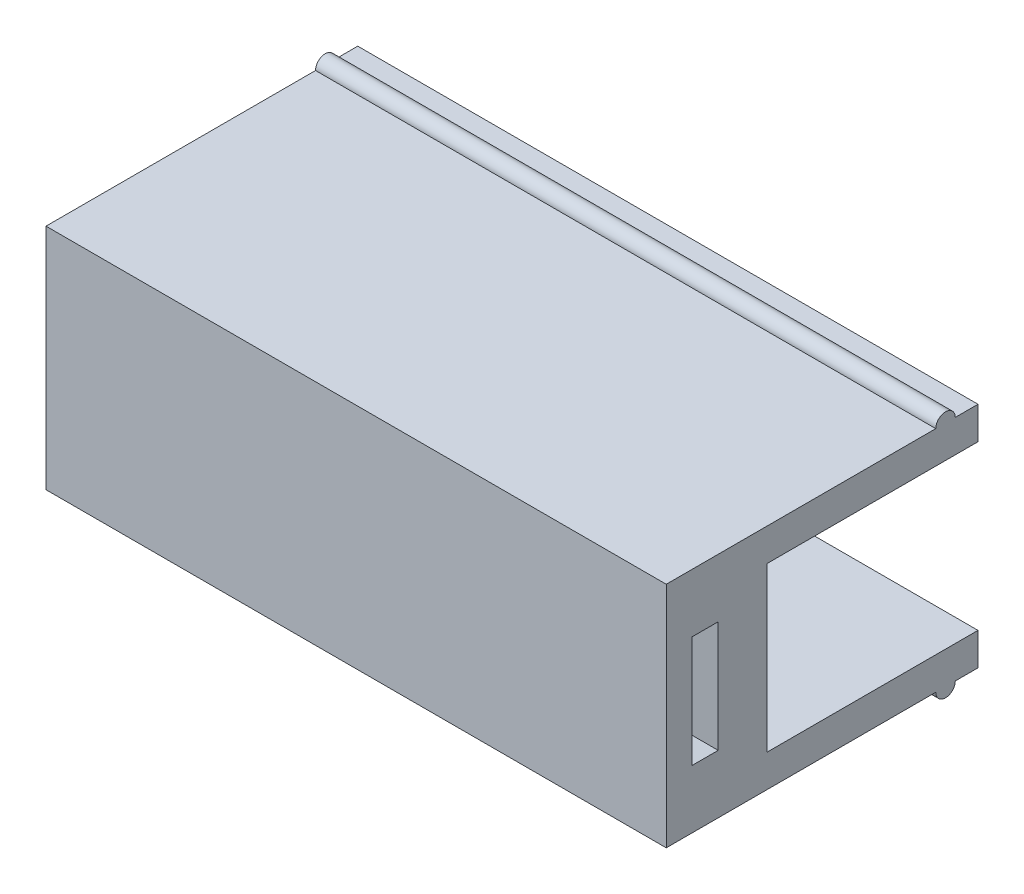
ISO-10303-21;
HEADER;
FILE_DESCRIPTION(('STEP AP214'),'2;1');
FILE_NAME('part.step','',(''),(''),'','','');
FILE_SCHEMA(('AUTOMOTIVE_DESIGN { 1 0 10303 214 1 1 1 1 }'));
ENDSEC;
DATA;
#1=APPLICATION_CONTEXT('core data for automotive mechanical design processes');
#2=APPLICATION_PROTOCOL_DEFINITION('international standard','automotive_design',2000,#1);
#3=PRODUCT_CONTEXT('',#1,'mechanical');
#4=PRODUCT('Part','Part','',(#3));
#5=PRODUCT_RELATED_PRODUCT_CATEGORY('part','',(#4));
#6=PRODUCT_DEFINITION_FORMATION('','',#4);
#7=PRODUCT_DEFINITION_CONTEXT('part definition',#1,'design');
#8=PRODUCT_DEFINITION('design','',#6,#7);
#9=PRODUCT_DEFINITION_SHAPE('','',#8);
#10=(LENGTH_UNIT() NAMED_UNIT(*) SI_UNIT(.MILLI.,.METRE.));
#11=(NAMED_UNIT(*) PLANE_ANGLE_UNIT() SI_UNIT($,.RADIAN.));
#12=(NAMED_UNIT(*) SI_UNIT($,.STERADIAN.) SOLID_ANGLE_UNIT());
#13=UNCERTAINTY_MEASURE_WITH_UNIT(LENGTH_MEASURE(1.E-05),#10,'distance_accuracy_value','');
#14=(GEOMETRIC_REPRESENTATION_CONTEXT(3) GLOBAL_UNCERTAINTY_ASSIGNED_CONTEXT((#13)) GLOBAL_UNIT_ASSIGNED_CONTEXT((#10,
#11,#12)) REPRESENTATION_CONTEXT('',''));
#15=CARTESIAN_POINT('',(0.,0.,0.));
#16=DIRECTION('',(0.,0.,1.));
#17=DIRECTION('',(1.,0.,0.));
#18=AXIS2_PLACEMENT_3D('',#15,#16,#17);
#19=CARTESIAN_POINT('',(-9.55,3.51500000000302,9.6));
#20=DIRECTION('',(0.,-1.,0.));
#21=DIRECTION('',(0.,0.,-1.));
#22=AXIS2_PLACEMENT_3D('',#19,#20,#21);
#23=PLANE('',#22);
#24=DIRECTION('',(0.,0.,-1.));
#25=VECTOR('',#24,1.);
#26=CARTESIAN_POINT('',(-9.55,3.51500000000302,9.6));
#27=LINE('',#26,#25);
#28=CARTESIAN_POINT('',(-9.55,3.51500000000302,0.699999999999999));
#29=VERTEX_POINT('',#28);
#30=CARTESIAN_POINT('',(-9.55,3.51500000000302,0.));
#31=VERTEX_POINT('',#30);
#32=EDGE_CURVE('E296',#29,#31,#27,.T.);
#33=ORIENTED_EDGE('',*,*,#32,.F.);
#34=DIRECTION('',(1.,0.,0.));
#35=VECTOR('',#34,1.);
#36=CARTESIAN_POINT('',(-9.55,3.51500000000302,0.699999999999999));
#37=LINE('',#36,#35);
#38=CARTESIAN_POINT('',(9.55,3.51500000000302,0.699999999999999));
#39=VERTEX_POINT('',#38);
#40=EDGE_CURVE('E11',#29,#39,#37,.T.);
#41=ORIENTED_EDGE('',*,*,#40,.T.);
#42=DIRECTION('',(0.,0.,-1.));
#43=VECTOR('',#42,1.);
#44=CARTESIAN_POINT('',(9.55,3.51500000000302,9.6));
#45=LINE('',#44,#43);
#46=CARTESIAN_POINT('',(9.55,3.51500000000302,0.));
#47=VERTEX_POINT('',#46);
#48=EDGE_CURVE('E312',#39,#47,#45,.T.);
#49=ORIENTED_EDGE('',*,*,#48,.T.);
#50=DIRECTION('',(-1.,0.,0.));
#51=VECTOR('',#50,1.);
#52=CARTESIAN_POINT('',(-9.55,3.51500000000302,0.));
#53=LINE('',#52,#51);
#54=EDGE_CURVE('E290',#47,#31,#53,.T.);
#55=ORIENTED_EDGE('',*,*,#54,.T.);
#56=EDGE_LOOP('',(#33,#41,#49,#55));
#57=FACE_BOUND('',#56,.T.);
#58=ADVANCED_FACE('F38',(#57),#23,.F.);
#59=CARTESIAN_POINT('',(-9.55,-3.51500000000302,9.6));
#60=DIRECTION('',(0.,1.,0.));
#61=DIRECTION('',(0.,0.,1.));
#62=AXIS2_PLACEMENT_3D('',#59,#60,#61);
#63=PLANE('',#62);
#64=DIRECTION('',(0.,0.,-1.));
#65=VECTOR('',#64,1.);
#66=CARTESIAN_POINT('',(-9.55,-3.51500000000302,9.6));
#67=LINE('',#66,#65);
#68=CARTESIAN_POINT('',(-9.55,-3.51500000000302,9.6));
#69=VERTEX_POINT('',#68);
#70=CARTESIAN_POINT('',(-9.55,-3.51500000000302,1.3));
#71=VERTEX_POINT('',#70);
#72=EDGE_CURVE('E320',#69,#71,#67,.T.);
#73=ORIENTED_EDGE('',*,*,#72,.T.);
#74=DIRECTION('',(1.,0.,0.));
#75=VECTOR('',#74,1.);
#76=CARTESIAN_POINT('',(-9.55,-3.51500000000302,1.3));
#77=LINE('',#76,#75);
#78=CARTESIAN_POINT('',(9.55,-3.51500000000302,1.3));
#79=VERTEX_POINT('',#78);
#80=EDGE_CURVE('E257',#71,#79,#77,.T.);
#81=ORIENTED_EDGE('',*,*,#80,.T.);
#82=DIRECTION('',(0.,0.,-1.));
#83=VECTOR('',#82,1.);
#84=CARTESIAN_POINT('',(9.55,-3.51500000000302,9.6));
#85=LINE('',#84,#83);
#86=CARTESIAN_POINT('',(9.55,-3.51500000000302,9.6));
#87=VERTEX_POINT('',#86);
#88=EDGE_CURVE('E316',#87,#79,#85,.T.);
#89=ORIENTED_EDGE('',*,*,#88,.F.);
#90=DIRECTION('',(1.,0.,0.));
#91=VECTOR('',#90,1.);
#92=CARTESIAN_POINT('',(-9.55,-3.51500000000302,9.6));
#93=LINE('',#92,#91);
#94=EDGE_CURVE('E289',#69,#87,#93,.T.);
#95=ORIENTED_EDGE('',*,*,#94,.F.);
#96=EDGE_LOOP('',(#73,#81,#89,#95));
#97=FACE_BOUND('',#96,.T.);
#98=ADVANCED_FACE('F371',(#97),#63,.F.);
#99=CARTESIAN_POINT('',(0.,0.,0.));
#100=DIRECTION('',(0.,0.,1.));
#101=DIRECTION('',(1.,0.,0.));
#102=AXIS2_PLACEMENT_3D('',#99,#100,#101);
#103=PLANE('',#102);
#104=DIRECTION('',(0.,-1.,0.));
#105=VECTOR('',#104,1.);
#106=CARTESIAN_POINT('',(-9.55,3.51500000000302,0.));
#107=LINE('',#106,#105);
#108=CARTESIAN_POINT('',(-9.55,-2.51500000000302,0.));
#109=VERTEX_POINT('',#108);
#110=CARTESIAN_POINT('',(-9.55,-3.51500000000302,0.));
#111=VERTEX_POINT('',#110);
#112=EDGE_CURVE('E279',#109,#111,#107,.T.);
#113=ORIENTED_EDGE('',*,*,#112,.F.);
#114=DIRECTION('',(-1.,0.,0.));
#115=VECTOR('',#114,1.);
#116=CARTESIAN_POINT('',(-9.55,-2.51500000000302,0.));
#117=LINE('',#116,#115);
#118=CARTESIAN_POINT('',(9.55,-2.51500000000302,0.));
#119=VERTEX_POINT('',#118);
#120=EDGE_CURVE('E265',#119,#109,#117,.T.);
#121=ORIENTED_EDGE('',*,*,#120,.F.);
#122=DIRECTION('',(0.,1.,0.));
#123=VECTOR('',#122,1.);
#124=CARTESIAN_POINT('',(9.55,3.51500000000302,0.));
#125=LINE('',#124,#123);
#126=CARTESIAN_POINT('',(9.55,-3.51500000000302,0.));
#127=VERTEX_POINT('',#126);
#128=EDGE_CURVE('E304',#127,#119,#125,.T.);
#129=ORIENTED_EDGE('',*,*,#128,.F.);
#130=DIRECTION('',(1.,0.,0.));
#131=VECTOR('',#130,1.);
#132=CARTESIAN_POINT('',(-9.55,-3.51500000000302,0.));
#133=LINE('',#132,#131);
#134=EDGE_CURVE('E300',#111,#127,#133,.T.);
#135=ORIENTED_EDGE('',*,*,#134,.F.);
#136=EDGE_LOOP('',(#113,#121,#129,#135));
#137=FACE_BOUND('',#136,.T.);
#138=ADVANCED_FACE('F362',(#137),#103,.F.);
#139=CARTESIAN_POINT('',(-9.55,3.51500000000302,9.6));
#140=DIRECTION('',(1.,0.,0.));
#141=DIRECTION('',(0.,0.,-1.));
#142=AXIS2_PLACEMENT_3D('',#139,#140,#141);
#143=PLANE('',#142);
#144=DIRECTION('',(0.,0.,1.));
#145=VECTOR('',#144,1.);
#146=CARTESIAN_POINT('',(-9.55,-1.71500000000302,8.));
#147=LINE('',#146,#145);
#148=CARTESIAN_POINT('',(-9.55,-1.71500000000302,8.));
#149=VERTEX_POINT('',#148);
#150=CARTESIAN_POINT('',(-9.55,-1.71500000000302,8.8));
#151=VERTEX_POINT('',#150);
#152=EDGE_CURVE('E190',#149,#151,#147,.T.);
#153=ORIENTED_EDGE('',*,*,#152,.F.);
#154=DIRECTION('',(0.,-1.,0.));
#155=VECTOR('',#154,1.);
#156=CARTESIAN_POINT('',(-9.55,1.71500000000302,8.));
#157=LINE('',#156,#155);
#158=CARTESIAN_POINT('',(-9.55,1.71500000000302,8.));
#159=VERTEX_POINT('',#158);
#160=EDGE_CURVE('E53',#159,#149,#157,.T.);
#161=ORIENTED_EDGE('',*,*,#160,.F.);
#162=DIRECTION('',(0.,0.,-1.));
#163=VECTOR('',#162,1.);
#164=CARTESIAN_POINT('',(-9.55,1.71500000000302,8.));
#165=LINE('',#164,#163);
#166=CARTESIAN_POINT('',(-9.55,1.71500000000302,8.8));
#167=VERTEX_POINT('',#166);
#168=EDGE_CURVE('E196',#167,#159,#165,.T.);
#169=ORIENTED_EDGE('',*,*,#168,.F.);
#170=DIRECTION('',(0.,1.,0.));
#171=VECTOR('',#170,1.);
#172=CARTESIAN_POINT('',(-9.55,1.71500000000302,8.8));
#173=LINE('',#172,#171);
#174=EDGE_CURVE('E179',#151,#167,#173,.T.);
#175=ORIENTED_EDGE('',*,*,#174,.F.);
#176=EDGE_LOOP('',(#153,#161,#169,#175));
#177=FACE_BOUND('',#176,.T.);
#178=CARTESIAN_POINT('',(-9.55,3.51500000000302,9.6));
#179=VERTEX_POINT('',#178);
#180=CARTESIAN_POINT('',(-9.55,3.51500000000302,1.3));
#181=VERTEX_POINT('',#180);
#182=EDGE_CURVE('E309',#179,#181,#27,.T.);
#183=ORIENTED_EDGE('',*,*,#182,.T.);
#184=CARTESIAN_POINT('',(-9.55,3.51500000000302,0.999999999999999));
#185=DIRECTION('',(1.,0.,0.));
#186=DIRECTION('',(0.,0.,-1.));
#187=AXIS2_PLACEMENT_3D('',#184,#185,#186);
#188=CIRCLE('',#187,0.3);
#189=EDGE_CURVE('E227',#29,#181,#188,.T.);
#190=ORIENTED_EDGE('',*,*,#189,.F.);
#191=ORIENTED_EDGE('',*,*,#32,.T.);
#192=CARTESIAN_POINT('',(-9.55,2.51500000000301,0.));
#193=VERTEX_POINT('',#192);
#194=EDGE_CURVE('E297',#31,#193,#107,.T.);
#195=ORIENTED_EDGE('',*,*,#194,.T.);
#196=DIRECTION('',(0.,0.,-1.));
#197=VECTOR('',#196,1.);
#198=CARTESIAN_POINT('',(-9.55,2.51500000000302,6.5));
#199=LINE('',#198,#197);
#200=CARTESIAN_POINT('',(-9.55,2.51500000000302,6.5));
#201=VERTEX_POINT('',#200);
#202=EDGE_CURVE('E273',#201,#193,#199,.T.);
#203=ORIENTED_EDGE('',*,*,#202,.F.);
#204=DIRECTION('',(0.,1.,0.));
#205=VECTOR('',#204,1.);
#206=CARTESIAN_POINT('',(-9.55,-2.51500000000302,6.5));
#207=LINE('',#206,#205);
#208=CARTESIAN_POINT('',(-9.55,-2.51500000000302,6.5));
#209=VERTEX_POINT('',#208);
#210=EDGE_CURVE('E261',#209,#201,#207,.T.);
#211=ORIENTED_EDGE('',*,*,#210,.F.);
#212=DIRECTION('',(0.,0.,-1.));
#213=VECTOR('',#212,1.);
#214=CARTESIAN_POINT('',(-9.55,-2.51500000000302,6.5));
#215=LINE('',#214,#213);
#216=EDGE_CURVE('E276',#209,#109,#215,.T.);
#217=ORIENTED_EDGE('',*,*,#216,.T.);
#218=ORIENTED_EDGE('',*,*,#112,.T.);
#219=CARTESIAN_POINT('',(-9.55,-3.51500000000302,0.699999999999999));
#220=VERTEX_POINT('',#219);
#221=EDGE_CURVE('E319',#220,#111,#67,.T.);
#222=ORIENTED_EDGE('',*,*,#221,.F.);
#223=CARTESIAN_POINT('',(-9.55,-3.51500000000302,0.999999999999999));
#224=DIRECTION('',(1.,0.,0.));
#225=DIRECTION('',(0.,0.,-1.));
#226=AXIS2_PLACEMENT_3D('',#223,#224,#225);
#227=CIRCLE('',#226,0.3);
#228=EDGE_CURVE('E251',#71,#220,#227,.T.);
#229=ORIENTED_EDGE('',*,*,#228,.F.);
#230=ORIENTED_EDGE('',*,*,#72,.F.);
#231=DIRECTION('',(0.,-1.,0.));
#232=VECTOR('',#231,1.);
#233=CARTESIAN_POINT('',(-9.55,3.51500000000302,9.6));
#234=LINE('',#233,#232);
#235=EDGE_CURVE('E286',#179,#69,#234,.T.);
#236=ORIENTED_EDGE('',*,*,#235,.F.);
#237=EDGE_LOOP('',(#183,#190,#191,#195,#203,#211,#217,#218,#222,#229,#230,#236));
#238=FACE_BOUND('',#237,.T.);
#239=ADVANCED_FACE('F40',(#177,#238),#143,.F.);
#240=CARTESIAN_POINT('',(9.55,-3.51500000000302,0.699999999999999));
#241=VERTEX_POINT('',#240);
#242=EDGE_CURVE('E315',#241,#127,#85,.T.);
#243=ORIENTED_EDGE('',*,*,#242,.F.);
#244=DIRECTION('',(1.,0.,0.));
#245=VECTOR('',#244,1.);
#246=CARTESIAN_POINT('',(-9.55,-3.51500000000302,0.699999999999999));
#247=LINE('',#246,#245);
#248=EDGE_CURVE('E253',#241,#220,#247,.F.);
#249=ORIENTED_EDGE('',*,*,#248,.T.);
#250=ORIENTED_EDGE('',*,*,#221,.T.);
#251=ORIENTED_EDGE('',*,*,#134,.T.);
#252=EDGE_LOOP('',(#243,#249,#250,#251));
#253=FACE_BOUND('',#252,.T.);
#254=ADVANCED_FACE('F366',(#253),#63,.F.);
#255=CARTESIAN_POINT('',(9.55,3.51500000000302,9.6));
#256=DIRECTION('',(-1.,0.,0.));
#257=DIRECTION('',(0.,0.,1.));
#258=AXIS2_PLACEMENT_3D('',#255,#256,#257);
#259=PLANE('',#258);
#260=DIRECTION('',(0.,0.,-1.));
#261=VECTOR('',#260,1.);
#262=CARTESIAN_POINT('',(9.55,-1.71500000000302,8.8));
#263=LINE('',#262,#261);
#264=CARTESIAN_POINT('',(9.55,-1.71500000000302,8.8));
#265=VERTEX_POINT('',#264);
#266=CARTESIAN_POINT('',(9.55,-1.71500000000302,8.));
#267=VERTEX_POINT('',#266);
#268=EDGE_CURVE('E215',#265,#267,#263,.T.);
#269=ORIENTED_EDGE('',*,*,#268,.F.);
#270=DIRECTION('',(0.,-1.,0.));
#271=VECTOR('',#270,1.);
#272=CARTESIAN_POINT('',(9.55,1.71500000000301,8.8));
#273=LINE('',#272,#271);
#274=CARTESIAN_POINT('',(9.55,1.71500000000301,8.8));
#275=VERTEX_POINT('',#274);
#276=EDGE_CURVE('E61',#275,#265,#273,.T.);
#277=ORIENTED_EDGE('',*,*,#276,.F.);
#278=DIRECTION('',(0.,0.,1.));
#279=VECTOR('',#278,1.);
#280=CARTESIAN_POINT('',(9.55,1.71500000000301,8.8));
#281=LINE('',#280,#279);
#282=CARTESIAN_POINT('',(9.55,1.71500000000301,8.));
#283=VERTEX_POINT('',#282);
#284=EDGE_CURVE('E221',#283,#275,#281,.T.);
#285=ORIENTED_EDGE('',*,*,#284,.F.);
#286=DIRECTION('',(0.,1.,0.));
#287=VECTOR('',#286,1.);
#288=CARTESIAN_POINT('',(9.55,1.71500000000301,8.));
#289=LINE('',#288,#287);
#290=EDGE_CURVE('E218',#267,#283,#289,.T.);
#291=ORIENTED_EDGE('',*,*,#290,.F.);
#292=EDGE_LOOP('',(#269,#277,#285,#291));
#293=FACE_BOUND('',#292,.T.);
#294=ORIENTED_EDGE('',*,*,#48,.F.);
#295=CARTESIAN_POINT('',(9.55,3.51500000000302,0.999999999999999));
#296=DIRECTION('',(1.,0.,0.));
#297=DIRECTION('',(0.,0.,-1.));
#298=AXIS2_PLACEMENT_3D('',#295,#296,#297);
#299=CIRCLE('',#298,0.3);
#300=CARTESIAN_POINT('',(9.55,3.51500000000302,1.3));
#301=VERTEX_POINT('',#300);
#302=EDGE_CURVE('E245',#39,#301,#299,.T.);
#303=ORIENTED_EDGE('',*,*,#302,.T.);
#304=CARTESIAN_POINT('',(9.55,3.51500000000302,9.6));
#305=VERTEX_POINT('',#304);
#306=EDGE_CURVE('E313',#305,#301,#45,.T.);
#307=ORIENTED_EDGE('',*,*,#306,.F.);
#308=DIRECTION('',(0.,1.,0.));
#309=VECTOR('',#308,1.);
#310=CARTESIAN_POINT('',(9.55,3.51500000000302,9.6));
#311=LINE('',#310,#309);
#312=EDGE_CURVE('E292',#87,#305,#311,.T.);
#313=ORIENTED_EDGE('',*,*,#312,.F.);
#314=ORIENTED_EDGE('',*,*,#88,.T.);
#315=CARTESIAN_POINT('',(9.55,-3.51500000000302,0.999999999999999));
#316=DIRECTION('',(1.,0.,0.));
#317=DIRECTION('',(0.,0.,-1.));
#318=AXIS2_PLACEMENT_3D('',#315,#316,#317);
#319=CIRCLE('',#318,0.3);
#320=EDGE_CURVE('E248',#79,#241,#319,.T.);
#321=ORIENTED_EDGE('',*,*,#320,.T.);
#322=ORIENTED_EDGE('',*,*,#242,.T.);
#323=ORIENTED_EDGE('',*,*,#128,.T.);
#324=DIRECTION('',(0.,0.,-1.));
#325=VECTOR('',#324,1.);
#326=CARTESIAN_POINT('',(9.55,-2.51500000000302,6.5));
#327=LINE('',#326,#325);
#328=CARTESIAN_POINT('',(9.55,-2.51500000000302,6.5));
#329=VERTEX_POINT('',#328);
#330=EDGE_CURVE('E280',#329,#119,#327,.T.);
#331=ORIENTED_EDGE('',*,*,#330,.F.);
#332=DIRECTION('',(0.,-1.,0.));
#333=VECTOR('',#332,1.);
#334=CARTESIAN_POINT('',(9.55,-2.51500000000302,6.5));
#335=LINE('',#334,#333);
#336=CARTESIAN_POINT('',(9.55,2.51500000000301,6.5));
#337=VERTEX_POINT('',#336);
#338=EDGE_CURVE('E268',#337,#329,#335,.T.);
#339=ORIENTED_EDGE('',*,*,#338,.F.);
#340=DIRECTION('',(0.,0.,-1.));
#341=VECTOR('',#340,1.);
#342=CARTESIAN_POINT('',(9.55,2.51500000000301,6.5));
#343=LINE('',#342,#341);
#344=CARTESIAN_POINT('',(9.55,2.51500000000301,0.));
#345=VERTEX_POINT('',#344);
#346=EDGE_CURVE('E282',#337,#345,#343,.T.);
#347=ORIENTED_EDGE('',*,*,#346,.T.);
#348=EDGE_CURVE('E303',#345,#47,#125,.T.);
#349=ORIENTED_EDGE('',*,*,#348,.T.);
#350=EDGE_LOOP('',(#294,#303,#307,#313,#314,#321,#322,#323,#331,#339,#347,#349));
#351=FACE_BOUND('',#350,.T.);
#352=ADVANCED_FACE('F349',(#293,#351),#259,.F.);
#353=ORIENTED_EDGE('',*,*,#306,.T.);
#354=DIRECTION('',(1.,0.,0.));
#355=VECTOR('',#354,1.);
#356=CARTESIAN_POINT('',(-9.55,3.51500000000302,1.3));
#357=LINE('',#356,#355);
#358=EDGE_CURVE('E46',#301,#181,#357,.F.);
#359=ORIENTED_EDGE('',*,*,#358,.T.);
#360=ORIENTED_EDGE('',*,*,#182,.F.);
#361=DIRECTION('',(-1.,0.,0.));
#362=VECTOR('',#361,1.);
#363=CARTESIAN_POINT('',(-9.55,3.51500000000302,9.6));
#364=LINE('',#363,#362);
#365=EDGE_CURVE('E294',#305,#179,#364,.T.);
#366=ORIENTED_EDGE('',*,*,#365,.F.);
#367=EDGE_LOOP('',(#353,#359,#360,#366));
#368=FACE_BOUND('',#367,.T.);
#369=ADVANCED_FACE('F325',(#368),#23,.F.);
#370=CARTESIAN_POINT('',(0.,0.,9.6));
#371=DIRECTION('',(0.,0.,1.));
#372=DIRECTION('',(1.,0.,0.));
#373=AXIS2_PLACEMENT_3D('',#370,#371,#372);
#374=PLANE('',#373);
#375=ORIENTED_EDGE('',*,*,#235,.T.);
#376=ORIENTED_EDGE('',*,*,#94,.T.);
#377=ORIENTED_EDGE('',*,*,#312,.T.);
#378=ORIENTED_EDGE('',*,*,#365,.T.);
#379=EDGE_LOOP('',(#375,#376,#377,#378));
#380=FACE_BOUND('',#379,.T.);
#381=ADVANCED_FACE('F375',(#380),#374,.T.);
#382=ORIENTED_EDGE('',*,*,#348,.F.);
#383=DIRECTION('',(1.,0.,0.));
#384=VECTOR('',#383,1.);
#385=CARTESIAN_POINT('',(-9.55,2.51500000000302,0.));
#386=LINE('',#385,#384);
#387=EDGE_CURVE('E260',#193,#345,#386,.T.);
#388=ORIENTED_EDGE('',*,*,#387,.F.);
#389=ORIENTED_EDGE('',*,*,#194,.F.);
#390=ORIENTED_EDGE('',*,*,#54,.F.);
#391=EDGE_LOOP('',(#382,#388,#389,#390));
#392=FACE_BOUND('',#391,.T.);
#393=ADVANCED_FACE('F344',(#392),#103,.F.);
#394=CARTESIAN_POINT('',(-9.55,-2.51500000000302,6.5));
#395=DIRECTION('',(0.,-1.,0.));
#396=DIRECTION('',(1.,0.,0.));
#397=AXIS2_PLACEMENT_3D('',#394,#395,#396);
#398=PLANE('',#397);
#399=ORIENTED_EDGE('',*,*,#120,.T.);
#400=ORIENTED_EDGE('',*,*,#216,.F.);
#401=DIRECTION('',(-1.,0.,0.));
#402=VECTOR('',#401,1.);
#403=CARTESIAN_POINT('',(-9.55,-2.51500000000302,6.5));
#404=LINE('',#403,#402);
#405=EDGE_CURVE('E270',#329,#209,#404,.T.);
#406=ORIENTED_EDGE('',*,*,#405,.F.);
#407=ORIENTED_EDGE('',*,*,#330,.T.);
#408=EDGE_LOOP('',(#399,#400,#406,#407));
#409=FACE_BOUND('',#408,.T.);
#410=ADVANCED_FACE('F355',(#409),#398,.F.);
#411=CARTESIAN_POINT('',(-9.55,2.51500000000302,6.5));
#412=DIRECTION('',(0.,1.,0.));
#413=DIRECTION('',(-1.,0.,0.));
#414=AXIS2_PLACEMENT_3D('',#411,#412,#413);
#415=PLANE('',#414);
#416=ORIENTED_EDGE('',*,*,#387,.T.);
#417=ORIENTED_EDGE('',*,*,#346,.F.);
#418=DIRECTION('',(1.,0.,0.));
#419=VECTOR('',#418,1.);
#420=CARTESIAN_POINT('',(-9.55,2.51500000000302,6.5));
#421=LINE('',#420,#419);
#422=EDGE_CURVE('E264',#201,#337,#421,.T.);
#423=ORIENTED_EDGE('',*,*,#422,.F.);
#424=ORIENTED_EDGE('',*,*,#202,.T.);
#425=EDGE_LOOP('',(#416,#417,#423,#424));
#426=FACE_BOUND('',#425,.T.);
#427=ADVANCED_FACE('F346',(#426),#415,.F.);
#428=CARTESIAN_POINT('',(0.,0.,6.5));
#429=DIRECTION('',(0.,0.,-1.));
#430=DIRECTION('',(-1.,0.,0.));
#431=AXIS2_PLACEMENT_3D('',#428,#429,#430);
#432=PLANE('',#431);
#433=ORIENTED_EDGE('',*,*,#210,.T.);
#434=ORIENTED_EDGE('',*,*,#422,.T.);
#435=ORIENTED_EDGE('',*,*,#338,.T.);
#436=ORIENTED_EDGE('',*,*,#405,.T.);
#437=EDGE_LOOP('',(#433,#434,#435,#436));
#438=FACE_BOUND('',#437,.T.);
#439=ADVANCED_FACE('F353',(#438),#432,.T.);
#440=CARTESIAN_POINT('',(-9.55,-3.51500000000302,0.999999999999999));
#441=DIRECTION('',(1.,0.,0.));
#442=DIRECTION('',(0.,0.,-1.));
#443=AXIS2_PLACEMENT_3D('',#440,#441,#442);
#444=CYLINDRICAL_SURFACE('',#443,0.3);
#445=ORIENTED_EDGE('',*,*,#80,.F.);
#446=ORIENTED_EDGE('',*,*,#228,.T.);
#447=ORIENTED_EDGE('',*,*,#248,.F.);
#448=ORIENTED_EDGE('',*,*,#320,.F.);
#449=EDGE_LOOP('',(#445,#446,#447,#448));
#450=FACE_BOUND('',#449,.T.);
#451=ADVANCED_FACE('F376',(#450),#444,.T.);
#452=CARTESIAN_POINT('',(-9.55,3.51500000000302,0.999999999999999));
#453=DIRECTION('',(1.,0.,0.));
#454=DIRECTION('',(0.,0.,-1.));
#455=AXIS2_PLACEMENT_3D('',#452,#453,#454);
#456=CYLINDRICAL_SURFACE('',#455,0.3);
#457=ORIENTED_EDGE('',*,*,#40,.F.);
#458=ORIENTED_EDGE('',*,*,#189,.T.);
#459=ORIENTED_EDGE('',*,*,#358,.F.);
#460=ORIENTED_EDGE('',*,*,#302,.F.);
#461=EDGE_LOOP('',(#457,#458,#459,#460));
#462=FACE_BOUND('',#461,.T.);
#463=ADVANCED_FACE('F334',(#462),#456,.T.);
#464=CARTESIAN_POINT('',(9.55,1.71500000000301,8.8));
#465=DIRECTION('',(-0.342020143325669,0.,0.939692620785908));
#466=DIRECTION('',(0.939692620785908,0.,0.342020143325669));
#467=AXIS2_PLACEMENT_3D('',#464,#465,#466);
#468=PLANE('',#467);
#469=ORIENTED_EDGE('',*,*,#276,.T.);
#470=DIRECTION('',(0.889126490715988,-0.323615577118185,0.323615577118185));
#471=VECTOR('',#470,1.);
#472=CARTESIAN_POINT('',(8.56306832428353,-1.35578624678776,8.44078624678474));
#473=LINE('',#472,#471);
#474=CARTESIAN_POINT('',(8.75,-1.42382381259006,8.50882381258704));
#475=VERTEX_POINT('',#474);
#476=EDGE_CURVE('E229',#475,#265,#473,.T.);
#477=ORIENTED_EDGE('',*,*,#476,.F.);
#478=DIRECTION('',(0.,-1.,0.));
#479=VECTOR('',#478,1.);
#480=CARTESIAN_POINT('',(8.75,0.,8.50882381258704));
#481=LINE('',#480,#479);
#482=CARTESIAN_POINT('',(8.75,1.42382381259005,8.50882381258704));
#483=VERTEX_POINT('',#482);
#484=EDGE_CURVE('E224',#483,#475,#481,.T.);
#485=ORIENTED_EDGE('',*,*,#484,.F.);
#486=DIRECTION('',(0.889126490715988,0.323615577118185,0.323615577118185));
#487=VECTOR('',#486,1.);
#488=CARTESIAN_POINT('',(9.55,1.71500000000301,8.8));
#489=LINE('',#488,#487);
#490=EDGE_CURVE('E225',#483,#275,#489,.T.);
#491=ORIENTED_EDGE('',*,*,#490,.T.);
#492=EDGE_LOOP('',(#469,#477,#485,#491));
#493=FACE_BOUND('',#492,.T.);
#494=ADVANCED_FACE('F383',(#493),#468,.F.);
#495=CARTESIAN_POINT('',(9.55,1.71500000000301,8.8));
#496=DIRECTION('',(-0.342020143325669,0.939692620785908,0.));
#497=DIRECTION('',(-0.939692620785908,-0.342020143325669,0.));
#498=AXIS2_PLACEMENT_3D('',#495,#496,#497);
#499=PLANE('',#498);
#500=ORIENTED_EDGE('',*,*,#284,.T.);
#501=ORIENTED_EDGE('',*,*,#490,.F.);
#502=DIRECTION('',(0.,0.,1.));
#503=VECTOR('',#502,1.);
#504=CARTESIAN_POINT('',(8.75,1.42382381259005,0.));
#505=LINE('',#504,#503);
#506=CARTESIAN_POINT('',(8.75,1.42382381259005,8.29117618741296));
#507=VERTEX_POINT('',#506);
#508=EDGE_CURVE('E232',#507,#483,#505,.T.);
#509=ORIENTED_EDGE('',*,*,#508,.F.);
#510=DIRECTION('',(0.889126490715988,0.323615577118185,-0.323615577118185));
#511=VECTOR('',#510,1.);
#512=CARTESIAN_POINT('',(9.55,1.71500000000301,8.));
#513=LINE('',#512,#511);
#514=EDGE_CURVE('E228',#507,#283,#513,.T.);
#515=ORIENTED_EDGE('',*,*,#514,.T.);
#516=EDGE_LOOP('',(#500,#501,#509,#515));
#517=FACE_BOUND('',#516,.T.);
#518=ADVANCED_FACE('F415',(#517),#499,.F.);
#519=CARTESIAN_POINT('',(9.55,1.71500000000301,8.));
#520=DIRECTION('',(-0.342020143325669,0.,-0.939692620785908));
#521=DIRECTION('',(-0.939692620785908,0.,0.342020143325669));
#522=AXIS2_PLACEMENT_3D('',#519,#520,#521);
#523=PLANE('',#522);
#524=ORIENTED_EDGE('',*,*,#290,.T.);
#525=ORIENTED_EDGE('',*,*,#514,.F.);
#526=DIRECTION('',(0.,1.,0.));
#527=VECTOR('',#526,1.);
#528=CARTESIAN_POINT('',(8.75,0.,8.29117618741296));
#529=LINE('',#528,#527);
#530=CARTESIAN_POINT('',(8.75,-1.42382381259006,8.29117618741296));
#531=VERTEX_POINT('',#530);
#532=EDGE_CURVE('E240',#531,#507,#529,.T.);
#533=ORIENTED_EDGE('',*,*,#532,.F.);
#534=DIRECTION('',(0.889126490715988,-0.323615577118185,-0.323615577118185));
#535=VECTOR('',#534,1.);
#536=CARTESIAN_POINT('',(9.3198118540607,-1.63121836660019,8.08378163340283));
#537=LINE('',#536,#535);
#538=EDGE_CURVE('E231',#531,#267,#537,.T.);
#539=ORIENTED_EDGE('',*,*,#538,.T.);
#540=EDGE_LOOP('',(#524,#525,#533,#539));
#541=FACE_BOUND('',#540,.T.);
#542=ADVANCED_FACE('F417',(#541),#523,.F.);
#543=CARTESIAN_POINT('',(9.55,-1.71500000000302,8.8));
#544=DIRECTION('',(-0.342020143325669,-0.939692620785908,0.));
#545=DIRECTION('',(0.939692620785908,-0.342020143325669,0.));
#546=AXIS2_PLACEMENT_3D('',#543,#544,#545);
#547=PLANE('',#546);
#548=ORIENTED_EDGE('',*,*,#268,.T.);
#549=ORIENTED_EDGE('',*,*,#538,.F.);
#550=DIRECTION('',(0.,0.,-1.));
#551=VECTOR('',#550,1.);
#552=CARTESIAN_POINT('',(8.75,-1.42382381259006,0.));
#553=LINE('',#552,#551);
#554=EDGE_CURVE('E237',#475,#531,#553,.T.);
#555=ORIENTED_EDGE('',*,*,#554,.F.);
#556=ORIENTED_EDGE('',*,*,#476,.T.);
#557=EDGE_LOOP('',(#548,#549,#555,#556));
#558=FACE_BOUND('',#557,.T.);
#559=ADVANCED_FACE('F407',(#558),#547,.F.);
#560=CARTESIAN_POINT('',(8.75,0.,0.));
#561=DIRECTION('',(1.,0.,0.));
#562=DIRECTION('',(0.,0.,-1.));
#563=AXIS2_PLACEMENT_3D('',#560,#561,#562);
#564=PLANE('',#563);
#565=ORIENTED_EDGE('',*,*,#484,.T.);
#566=ORIENTED_EDGE('',*,*,#554,.T.);
#567=ORIENTED_EDGE('',*,*,#532,.T.);
#568=ORIENTED_EDGE('',*,*,#508,.T.);
#569=EDGE_LOOP('',(#565,#566,#567,#568));
#570=FACE_BOUND('',#569,.T.);
#571=ADVANCED_FACE('F413',(#570),#564,.T.);
#572=CARTESIAN_POINT('',(-9.55,1.71500000000302,8.));
#573=DIRECTION('',(0.342020143325669,0.,-0.939692620785908));
#574=DIRECTION('',(-0.939692620785908,0.,-0.342020143325669));
#575=AXIS2_PLACEMENT_3D('',#572,#573,#574);
#576=PLANE('',#575);
#577=ORIENTED_EDGE('',*,*,#160,.T.);
#578=DIRECTION('',(-0.889126490715988,-0.323615577118185,-0.323615577118185));
#579=VECTOR('',#578,1.);
#580=CARTESIAN_POINT('',(-8.56306832428353,-1.35578624678776,8.35921375321526));
#581=LINE('',#580,#579);
#582=CARTESIAN_POINT('',(-8.75,-1.42382381259005,8.29117618741296));
#583=VERTEX_POINT('',#582);
#584=EDGE_CURVE('E187',#583,#149,#581,.T.);
#585=ORIENTED_EDGE('',*,*,#584,.F.);
#586=DIRECTION('',(0.,-1.,0.));
#587=VECTOR('',#586,1.);
#588=CARTESIAN_POINT('',(-8.75,0.,8.29117618741296));
#589=LINE('',#588,#587);
#590=CARTESIAN_POINT('',(-8.75,1.42382381259005,8.29117618741296));
#591=VERTEX_POINT('',#590);
#592=EDGE_CURVE('E198',#591,#583,#589,.T.);
#593=ORIENTED_EDGE('',*,*,#592,.F.);
#594=DIRECTION('',(-0.889126490715988,0.323615577118185,-0.323615577118185));
#595=VECTOR('',#594,1.);
#596=CARTESIAN_POINT('',(-9.55,1.71500000000302,8.));
#597=LINE('',#596,#595);
#598=EDGE_CURVE('E202',#591,#159,#597,.T.);
#599=ORIENTED_EDGE('',*,*,#598,.T.);
#600=EDGE_LOOP('',(#577,#585,#593,#599));
#601=FACE_BOUND('',#600,.T.);
#602=ADVANCED_FACE('F431',(#601),#576,.F.);
#603=CARTESIAN_POINT('',(-9.55,1.71500000000302,8.));
#604=DIRECTION('',(0.342020143325669,0.939692620785908,0.));
#605=DIRECTION('',(-0.939692620785908,0.342020143325669,0.));
#606=AXIS2_PLACEMENT_3D('',#603,#604,#605);
#607=PLANE('',#606);
#608=ORIENTED_EDGE('',*,*,#168,.T.);
#609=ORIENTED_EDGE('',*,*,#598,.F.);
#610=DIRECTION('',(0.,0.,-1.));
#611=VECTOR('',#610,1.);
#612=CARTESIAN_POINT('',(-8.75,1.42382381259005,0.));
#613=LINE('',#612,#611);
#614=CARTESIAN_POINT('',(-8.75,1.42382381259005,8.50882381258704));
#615=VERTEX_POINT('',#614);
#616=EDGE_CURVE('E204',#615,#591,#613,.T.);
#617=ORIENTED_EDGE('',*,*,#616,.F.);
#618=DIRECTION('',(-0.889126490715988,0.323615577118185,0.323615577118185));
#619=VECTOR('',#618,1.);
#620=CARTESIAN_POINT('',(-9.55,1.71500000000302,8.8));
#621=LINE('',#620,#619);
#622=EDGE_CURVE('E186',#615,#167,#621,.T.);
#623=ORIENTED_EDGE('',*,*,#622,.T.);
#624=EDGE_LOOP('',(#608,#609,#617,#623));
#625=FACE_BOUND('',#624,.T.);
#626=ADVANCED_FACE('F432',(#625),#607,.F.);
#627=CARTESIAN_POINT('',(-9.55,1.71500000000302,8.8));
#628=DIRECTION('',(0.342020143325669,0.,0.939692620785908));
#629=DIRECTION('',(0.939692620785908,0.,-0.342020143325669));
#630=AXIS2_PLACEMENT_3D('',#627,#628,#629);
#631=PLANE('',#630);
#632=ORIENTED_EDGE('',*,*,#174,.T.);
#633=ORIENTED_EDGE('',*,*,#622,.F.);
#634=DIRECTION('',(0.,1.,0.));
#635=VECTOR('',#634,1.);
#636=CARTESIAN_POINT('',(-8.75,0.,8.50882381258704));
#637=LINE('',#636,#635);
#638=CARTESIAN_POINT('',(-8.75,-1.42382381259005,8.50882381258704));
#639=VERTEX_POINT('',#638);
#640=EDGE_CURVE('E182',#639,#615,#637,.T.);
#641=ORIENTED_EDGE('',*,*,#640,.F.);
#642=DIRECTION('',(-0.889126490715988,-0.323615577118185,0.323615577118185));
#643=VECTOR('',#642,1.);
#644=CARTESIAN_POINT('',(-9.3198118540607,-1.63121836660019,8.71621836659717));
#645=LINE('',#644,#643);
#646=EDGE_CURVE('E175',#639,#151,#645,.T.);
#647=ORIENTED_EDGE('',*,*,#646,.T.);
#648=EDGE_LOOP('',(#632,#633,#641,#647));
#649=FACE_BOUND('',#648,.T.);
#650=ADVANCED_FACE('F177',(#649),#631,.F.);
#651=CARTESIAN_POINT('',(-9.55,-1.71500000000302,8.));
#652=DIRECTION('',(0.342020143325669,-0.939692620785908,0.));
#653=DIRECTION('',(0.939692620785908,0.342020143325669,0.));
#654=AXIS2_PLACEMENT_3D('',#651,#652,#653);
#655=PLANE('',#654);
#656=ORIENTED_EDGE('',*,*,#152,.T.);
#657=ORIENTED_EDGE('',*,*,#646,.F.);
#658=DIRECTION('',(0.,0.,1.));
#659=VECTOR('',#658,1.);
#660=CARTESIAN_POINT('',(-8.75,-1.42382381259005,0.));
#661=LINE('',#660,#659);
#662=EDGE_CURVE('E209',#583,#639,#661,.T.);
#663=ORIENTED_EDGE('',*,*,#662,.F.);
#664=ORIENTED_EDGE('',*,*,#584,.T.);
#665=EDGE_LOOP('',(#656,#657,#663,#664));
#666=FACE_BOUND('',#665,.T.);
#667=ADVANCED_FACE('F191',(#666),#655,.F.);
#668=CARTESIAN_POINT('',(-8.75,0.,0.));
#669=DIRECTION('',(-1.,0.,0.));
#670=DIRECTION('',(0.,0.,1.));
#671=AXIS2_PLACEMENT_3D('',#668,#669,#670);
#672=PLANE('',#671);
#673=ORIENTED_EDGE('',*,*,#592,.T.);
#674=ORIENTED_EDGE('',*,*,#662,.T.);
#675=ORIENTED_EDGE('',*,*,#640,.T.);
#676=ORIENTED_EDGE('',*,*,#616,.T.);
#677=EDGE_LOOP('',(#673,#674,#675,#676));
#678=FACE_BOUND('',#677,.T.);
#679=ADVANCED_FACE('F440',(#678),#672,.T.);
#680=CLOSED_SHELL('',(#58,#98,#138,#239,#254,#352,#369,#381,#393,#410,#427,#439,#451,#463,#494,
#518,#542,#559,#571,#602,#626,#650,#667,#679));
#681=MANIFOLD_SOLID_BREP('B2',#680);
#682=ADVANCED_BREP_SHAPE_REPRESENTATION('',(#18,#681),#14);
#683=SHAPE_DEFINITION_REPRESENTATION(#9,#682);
ENDSEC;
END-ISO-10303-21;
